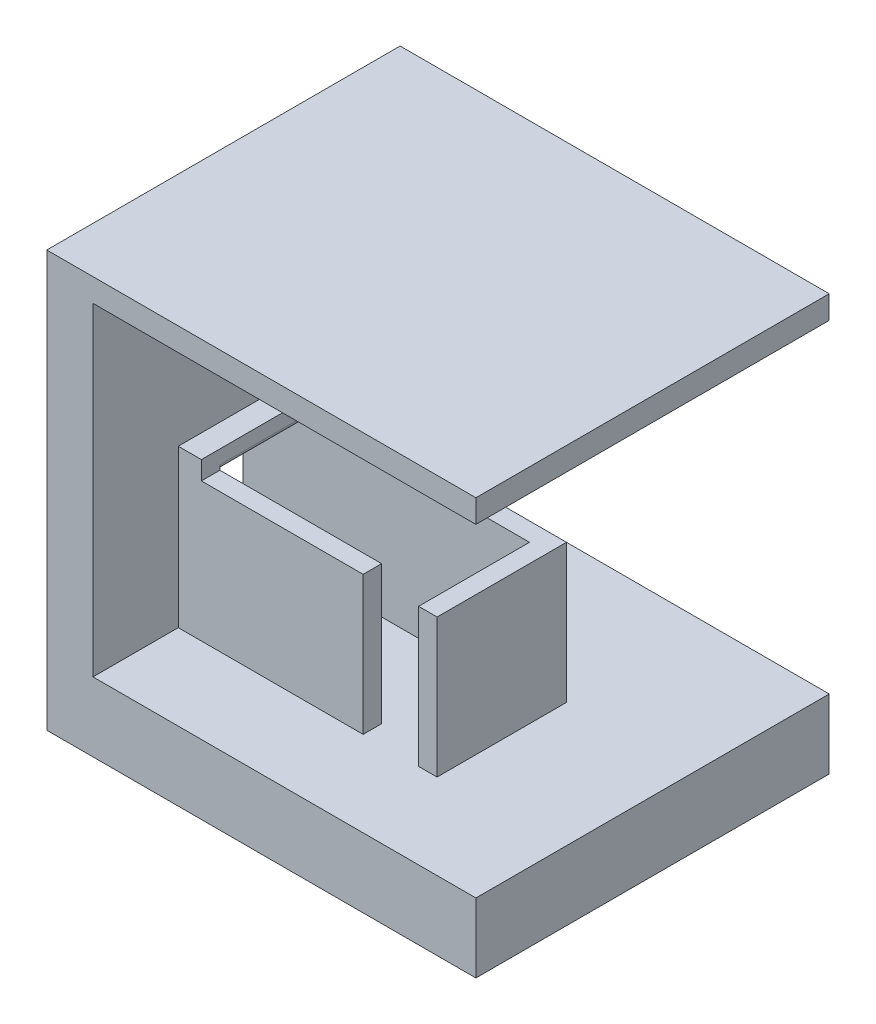
ISO-10303-21;
HEADER;
FILE_DESCRIPTION(('STEP AP214'),'2;1');
FILE_NAME('part.step','',(''),(''),'','','');
FILE_SCHEMA(('AUTOMOTIVE_DESIGN { 1 0 10303 214 1 1 1 1 }'));
ENDSEC;
DATA;
#1=APPLICATION_CONTEXT('core data for automotive mechanical design processes');
#2=APPLICATION_PROTOCOL_DEFINITION('international standard','automotive_design',2000,#1);
#3=PRODUCT_CONTEXT('',#1,'mechanical');
#4=PRODUCT('Part','Part','',(#3));
#5=PRODUCT_RELATED_PRODUCT_CATEGORY('part','',(#4));
#6=PRODUCT_DEFINITION_FORMATION('','',#4);
#7=PRODUCT_DEFINITION_CONTEXT('part definition',#1,'design');
#8=PRODUCT_DEFINITION('design','',#6,#7);
#9=PRODUCT_DEFINITION_SHAPE('','',#8);
#10=(LENGTH_UNIT() NAMED_UNIT(*) SI_UNIT(.MILLI.,.METRE.));
#11=(NAMED_UNIT(*) PLANE_ANGLE_UNIT() SI_UNIT($,.RADIAN.));
#12=(NAMED_UNIT(*) SI_UNIT($,.STERADIAN.) SOLID_ANGLE_UNIT());
#13=UNCERTAINTY_MEASURE_WITH_UNIT(LENGTH_MEASURE(1.E-05),#10,'distance_accuracy_value','');
#14=(GEOMETRIC_REPRESENTATION_CONTEXT(3) GLOBAL_UNCERTAINTY_ASSIGNED_CONTEXT((#13)) GLOBAL_UNIT_ASSIGNED_CONTEXT((#10,
#11,#12)) REPRESENTATION_CONTEXT('',''));
#15=CARTESIAN_POINT('',(0.,0.,0.));
#16=DIRECTION('',(0.,0.,1.));
#17=DIRECTION('',(1.,0.,0.));
#18=AXIS2_PLACEMENT_3D('',#15,#16,#17);
#19=CARTESIAN_POINT('',(-75.,20.,225.));
#20=DIRECTION('',(0.,-1.,0.));
#21=DIRECTION('',(0.,0.,-1.));
#22=AXIS2_PLACEMENT_3D('',#19,#20,#21);
#23=PLANE('',#22);
#24=DIRECTION('',(0.,0.,1.));
#25=VECTOR('',#24,1.);
#26=CARTESIAN_POINT('',(-28.5759394921588,20.,225.));
#27=LINE('',#26,#25);
#28=CARTESIAN_POINT('',(-28.5759394921588,20.,0.));
#29=VERTEX_POINT('',#28);
#30=CARTESIAN_POINT('',(-28.5759394921588,20.,38.2251271277598));
#31=VERTEX_POINT('',#30);
#32=EDGE_CURVE('E364',#29,#31,#27,.T.);
#33=ORIENTED_EDGE('',*,*,#32,.F.);
#34=DIRECTION('',(-1.,0.,0.));
#35=VECTOR('',#34,1.);
#36=CARTESIAN_POINT('',(-75.,20.,0.));
#37=LINE('',#36,#35);
#38=CARTESIAN_POINT('',(-75.,20.,0.));
#39=VERTEX_POINT('',#38);
#40=EDGE_CURVE('E493',#29,#39,#37,.T.);
#41=ORIENTED_EDGE('',*,*,#40,.T.);
#42=DIRECTION('',(0.,0.,-1.));
#43=VECTOR('',#42,1.);
#44=CARTESIAN_POINT('',(-75.,20.,225.));
#45=LINE('',#44,#43);
#46=CARTESIAN_POINT('',(-75.,20.,38.2251271277598));
#47=VERTEX_POINT('',#46);
#48=EDGE_CURVE('E502',#47,#39,#45,.T.);
#49=ORIENTED_EDGE('',*,*,#48,.F.);
#50=DIRECTION('',(-1.,0.,0.));
#51=VECTOR('',#50,1.);
#52=CARTESIAN_POINT('',(-75.,20.,38.2251271277598));
#53=LINE('',#52,#51);
#54=EDGE_CURVE('E705',#31,#47,#53,.T.);
#55=ORIENTED_EDGE('',*,*,#54,.F.);
#56=EDGE_LOOP('',(#33,#41,#49,#55));
#57=FACE_BOUND('',#56,.T.);
#58=ADVANCED_FACE('F173',(#57),#23,.F.);
#59=CARTESIAN_POINT('',(0.,0.,0.));
#60=DIRECTION('',(0.,0.,1.));
#61=DIRECTION('',(1.,0.,0.));
#62=AXIS2_PLACEMENT_3D('',#59,#60,#61);
#63=PLANE('',#62);
#64=DIRECTION('',(0.,1.,0.));
#65=VECTOR('',#64,1.);
#66=CARTESIAN_POINT('',(-28.5759394921588,-25.,0.));
#67=LINE('',#66,#65);
#68=CARTESIAN_POINT('',(-28.5759394921588,-25.,0.));
#69=VERTEX_POINT('',#68);
#70=CARTESIAN_POINT('',(-28.5759394921588,-17.5,0.));
#71=VERTEX_POINT('',#70);
#72=EDGE_CURVE('E331',#69,#71,#67,.T.);
#73=ORIENTED_EDGE('',*,*,#72,.F.);
#74=DIRECTION('',(1.,0.,0.));
#75=VECTOR('',#74,1.);
#76=CARTESIAN_POINT('',(-70.,-25.,0.));
#77=LINE('',#76,#75);
#78=CARTESIAN_POINT('',(-75.,-25.,0.));
#79=VERTEX_POINT('',#78);
#80=EDGE_CURVE('E345',#79,#69,#77,.T.);
#81=ORIENTED_EDGE('',*,*,#80,.F.);
#82=DIRECTION('',(0.,-1.,0.));
#83=VECTOR('',#82,1.);
#84=CARTESIAN_POINT('',(-75.,20.,0.));
#85=LINE('',#84,#83);
#86=EDGE_CURVE('E499',#39,#79,#85,.T.);
#87=ORIENTED_EDGE('',*,*,#86,.F.);
#88=ORIENTED_EDGE('',*,*,#40,.F.);
#89=CARTESIAN_POINT('',(-28.5759394921588,17.5,0.));
#90=VERTEX_POINT('',#89);
#91=EDGE_CURVE('E351',#90,#29,#67,.T.);
#92=ORIENTED_EDGE('',*,*,#91,.F.);
#93=DIRECTION('',(-1.,0.,0.));
#94=VECTOR('',#93,1.);
#95=CARTESIAN_POINT('',(-70.,17.5,0.));
#96=LINE('',#95,#94);
#97=CARTESIAN_POINT('',(-70.,17.5,0.));
#98=VERTEX_POINT('',#97);
#99=EDGE_CURVE('E483',#90,#98,#96,.T.);
#100=ORIENTED_EDGE('',*,*,#99,.T.);
#101=DIRECTION('',(0.,-1.,0.));
#102=VECTOR('',#101,1.);
#103=CARTESIAN_POINT('',(-70.,-17.5,0.));
#104=LINE('',#103,#102);
#105=CARTESIAN_POINT('',(-70.,-17.5,0.));
#106=VERTEX_POINT('',#105);
#107=EDGE_CURVE('E480',#98,#106,#104,.T.);
#108=ORIENTED_EDGE('',*,*,#107,.T.);
#109=DIRECTION('',(1.,0.,0.));
#110=VECTOR('',#109,1.);
#111=CARTESIAN_POINT('',(-70.,-17.5,0.));
#112=LINE('',#111,#110);
#113=EDGE_CURVE('E348',#106,#71,#112,.T.);
#114=ORIENTED_EDGE('',*,*,#113,.T.);
#115=EDGE_LOOP('',(#73,#81,#87,#88,#92,#100,#108,#114));
#116=FACE_BOUND('',#115,.T.);
#117=ADVANCED_FACE('F343',(#116),#63,.F.);
#118=CARTESIAN_POINT('',(-70.,-17.5,50.));
#119=DIRECTION('',(1.,0.,0.));
#120=DIRECTION('',(0.,1.,0.));
#121=AXIS2_PLACEMENT_3D('',#118,#119,#120);
#122=PLANE('',#121);
#123=DIRECTION('',(0.,0.,-1.));
#124=VECTOR('',#123,1.);
#125=CARTESIAN_POINT('',(-70.,-17.5,50.));
#126=LINE('',#125,#124);
#127=CARTESIAN_POINT('',(-70.,-17.5,15.));
#128=VERTEX_POINT('',#127);
#129=EDGE_CURVE('E494',#128,#106,#126,.T.);
#130=ORIENTED_EDGE('',*,*,#129,.T.);
#131=ORIENTED_EDGE('',*,*,#107,.F.);
#132=DIRECTION('',(0.,0.,-1.));
#133=VECTOR('',#132,1.);
#134=CARTESIAN_POINT('',(-70.,17.5,50.));
#135=LINE('',#134,#133);
#136=CARTESIAN_POINT('',(-70.,17.5,38.2251271277598));
#137=VERTEX_POINT('',#136);
#138=EDGE_CURVE('E489',#137,#98,#135,.T.);
#139=ORIENTED_EDGE('',*,*,#138,.F.);
#140=DIRECTION('',(0.,-1.,0.));
#141=VECTOR('',#140,1.);
#142=CARTESIAN_POINT('',(-70.,-17.5,38.2251271277598));
#143=LINE('',#142,#141);
#144=CARTESIAN_POINT('',(-70.,-17.5,38.2251271277598));
#145=VERTEX_POINT('',#144);
#146=EDGE_CURVE('E712',#137,#145,#143,.T.);
#147=ORIENTED_EDGE('',*,*,#146,.T.);
#148=CARTESIAN_POINT('',(-70.,-17.5,29.));
#149=VERTEX_POINT('',#148);
#150=EDGE_CURVE('E490',#145,#149,#126,.T.);
#151=ORIENTED_EDGE('',*,*,#150,.T.);
#152=DIRECTION('',(0.,-1.,0.));
#153=VECTOR('',#152,1.);
#154=CARTESIAN_POINT('',(-70.,-2.50000000000001,29.));
#155=LINE('',#154,#153);
#156=CARTESIAN_POINT('',(-70.,-0.500000000000007,29.));
#157=VERTEX_POINT('',#156);
#158=EDGE_CURVE('E413',#157,#149,#155,.T.);
#159=ORIENTED_EDGE('',*,*,#158,.F.);
#160=DIRECTION('',(0.,0.,1.));
#161=VECTOR('',#160,1.);
#162=CARTESIAN_POINT('',(-70.,-0.500000000000006,15.));
#163=LINE('',#162,#161);
#164=CARTESIAN_POINT('',(-70.,-0.500000000000007,15.));
#165=VERTEX_POINT('',#164);
#166=EDGE_CURVE('E357',#165,#157,#163,.T.);
#167=ORIENTED_EDGE('',*,*,#166,.F.);
#168=DIRECTION('',(0.,-1.,0.));
#169=VECTOR('',#168,1.);
#170=CARTESIAN_POINT('',(-70.,-2.50000000000001,15.));
#171=LINE('',#170,#169);
#172=EDGE_CURVE('E445',#165,#128,#171,.T.);
#173=ORIENTED_EDGE('',*,*,#172,.T.);
#174=EDGE_LOOP('',(#130,#131,#139,#147,#151,#159,#167,#173));
#175=FACE_BOUND('',#174,.T.);
#176=ADVANCED_FACE('F694',(#175),#122,.T.);
#177=CARTESIAN_POINT('',(-75.,20.,225.));
#178=DIRECTION('',(1.,0.,0.));
#179=DIRECTION('',(0.,0.,-1.));
#180=AXIS2_PLACEMENT_3D('',#177,#178,#179);
#181=PLANE('',#180);
#182=DIRECTION('',(0.,0.,1.));
#183=VECTOR('',#182,1.);
#184=CARTESIAN_POINT('',(-75.,-17.5,225.));
#185=LINE('',#184,#183);
#186=CARTESIAN_POINT('',(-75.,-17.5,17.));
#187=VERTEX_POINT('',#186);
#188=CARTESIAN_POINT('',(-75.,-17.5,27.));
#189=VERTEX_POINT('',#188);
#190=EDGE_CURVE('E518',#187,#189,#185,.T.);
#191=ORIENTED_EDGE('',*,*,#190,.F.);
#192=DIRECTION('',(0.,-1.,0.));
#193=VECTOR('',#192,1.);
#194=CARTESIAN_POINT('',(-75.,20.,17.));
#195=LINE('',#194,#193);
#196=CARTESIAN_POINT('',(-75.,-2.5,17.));
#197=VERTEX_POINT('',#196);
#198=EDGE_CURVE('E506',#197,#187,#195,.T.);
#199=ORIENTED_EDGE('',*,*,#198,.F.);
#200=DIRECTION('',(0.,0.,-1.));
#201=VECTOR('',#200,1.);
#202=CARTESIAN_POINT('',(-75.,-2.5,225.));
#203=LINE('',#202,#201);
#204=CARTESIAN_POINT('',(-75.,-2.5,27.));
#205=VERTEX_POINT('',#204);
#206=EDGE_CURVE('E510',#205,#197,#203,.T.);
#207=ORIENTED_EDGE('',*,*,#206,.F.);
#208=DIRECTION('',(0.,1.,0.));
#209=VECTOR('',#208,1.);
#210=CARTESIAN_POINT('',(-75.,20.,27.));
#211=LINE('',#210,#209);
#212=EDGE_CURVE('E514',#189,#205,#211,.T.);
#213=ORIENTED_EDGE('',*,*,#212,.F.);
#214=EDGE_LOOP('',(#191,#199,#207,#213));
#215=FACE_BOUND('',#214,.T.);
#216=ORIENTED_EDGE('',*,*,#86,.T.);
#217=DIRECTION('',(0.,0.,-1.));
#218=VECTOR('',#217,1.);
#219=CARTESIAN_POINT('',(-75.,-25.,82.));
#220=LINE('',#219,#218);
#221=CARTESIAN_POINT('',(-75.,-25.,38.2251271277598));
#222=VERTEX_POINT('',#221);
#223=EDGE_CURVE('E355',#222,#79,#220,.T.);
#224=ORIENTED_EDGE('',*,*,#223,.F.);
#225=DIRECTION('',(0.,1.,0.));
#226=VECTOR('',#225,1.);
#227=CARTESIAN_POINT('',(-75.,-25.,38.2251271277598));
#228=LINE('',#227,#226);
#229=EDGE_CURVE('E189',#222,#47,#228,.T.);
#230=ORIENTED_EDGE('',*,*,#229,.T.);
#231=ORIENTED_EDGE('',*,*,#48,.T.);
#232=EDGE_LOOP('',(#216,#224,#230,#231));
#233=FACE_BOUND('',#232,.T.);
#234=ADVANCED_FACE('F558',(#215,#233),#181,.F.);
#235=CARTESIAN_POINT('',(-70.,-17.5,50.));
#236=DIRECTION('',(0.,1.,0.));
#237=DIRECTION('',(0.,0.,1.));
#238=AXIS2_PLACEMENT_3D('',#235,#236,#237);
#239=PLANE('',#238);
#240=DIRECTION('',(1.,0.,0.));
#241=VECTOR('',#240,1.);
#242=CARTESIAN_POINT('',(-70.,-17.5,38.2251271277598));
#243=LINE('',#242,#241);
#244=CARTESIAN_POINT('',(-28.5759394921588,-17.5,38.2251271277598));
#245=VERTEX_POINT('',#244);
#246=EDGE_CURVE('E698',#145,#245,#243,.T.);
#247=ORIENTED_EDGE('',*,*,#246,.T.);
#248=DIRECTION('',(0.,0.,-1.));
#249=VECTOR('',#248,1.);
#250=CARTESIAN_POINT('',(-28.5759394921588,-17.5,50.));
#251=LINE('',#250,#249);
#252=EDGE_CURVE('E696',#245,#71,#251,.T.);
#253=ORIENTED_EDGE('',*,*,#252,.T.);
#254=ORIENTED_EDGE('',*,*,#113,.F.);
#255=ORIENTED_EDGE('',*,*,#129,.F.);
#256=DIRECTION('',(1.,0.,0.));
#257=VECTOR('',#256,1.);
#258=CARTESIAN_POINT('',(-70.,-17.5,15.));
#259=LINE('',#258,#257);
#260=CARTESIAN_POINT('',(-42.,-17.5,15.));
#261=VERTEX_POINT('',#260);
#262=EDGE_CURVE('E458',#128,#261,#259,.T.);
#263=ORIENTED_EDGE('',*,*,#262,.T.);
#264=DIRECTION('',(0.,0.,1.));
#265=VECTOR('',#264,1.);
#266=CARTESIAN_POINT('',(-42.,-17.5,175.));
#267=LINE('',#266,#265);
#268=CARTESIAN_POINT('',(-42.,-17.5,29.));
#269=VERTEX_POINT('',#268);
#270=EDGE_CURVE('E455',#261,#269,#267,.T.);
#271=ORIENTED_EDGE('',*,*,#270,.T.);
#272=DIRECTION('',(-1.,0.,0.));
#273=VECTOR('',#272,1.);
#274=CARTESIAN_POINT('',(-70.,-17.5,29.));
#275=LINE('',#274,#273);
#276=CARTESIAN_POINT('',(-44.,-17.5,29.));
#277=VERTEX_POINT('',#276);
#278=EDGE_CURVE('E452',#269,#277,#275,.T.);
#279=ORIENTED_EDGE('',*,*,#278,.T.);
#280=DIRECTION('',(0.,0.,-1.));
#281=VECTOR('',#280,1.);
#282=CARTESIAN_POINT('',(-44.,-17.5,175.));
#283=LINE('',#282,#281);
#284=CARTESIAN_POINT('',(-44.,-17.5,17.));
#285=VERTEX_POINT('',#284);
#286=EDGE_CURVE('E449',#277,#285,#283,.T.);
#287=ORIENTED_EDGE('',*,*,#286,.T.);
#288=DIRECTION('',(1.,0.,0.));
#289=VECTOR('',#288,1.);
#290=CARTESIAN_POINT('',(-70.,-17.5,17.));
#291=LINE('',#290,#289);
#292=EDGE_CURVE('E417',#187,#285,#291,.T.);
#293=ORIENTED_EDGE('',*,*,#292,.F.);
#294=ORIENTED_EDGE('',*,*,#190,.T.);
#295=DIRECTION('',(1.,0.,0.));
#296=VECTOR('',#295,1.);
#297=CARTESIAN_POINT('',(-70.,-17.5,27.));
#298=LINE('',#297,#296);
#299=CARTESIAN_POINT('',(-50.,-17.5,27.));
#300=VERTEX_POINT('',#299);
#301=EDGE_CURVE('E389',#189,#300,#298,.T.);
#302=ORIENTED_EDGE('',*,*,#301,.T.);
#303=DIRECTION('',(0.,0.,1.));
#304=VECTOR('',#303,1.);
#305=CARTESIAN_POINT('',(-50.,-17.5,175.));
#306=LINE('',#305,#304);
#307=CARTESIAN_POINT('',(-50.,-17.5,29.));
#308=VERTEX_POINT('',#307);
#309=EDGE_CURVE('E406',#300,#308,#306,.T.);
#310=ORIENTED_EDGE('',*,*,#309,.T.);
#311=DIRECTION('',(-1.,0.,0.));
#312=VECTOR('',#311,1.);
#313=CARTESIAN_POINT('',(-70.,-17.5,29.));
#314=LINE('',#313,#312);
#315=EDGE_CURVE('E409',#308,#149,#314,.T.);
#316=ORIENTED_EDGE('',*,*,#315,.T.);
#317=ORIENTED_EDGE('',*,*,#150,.F.);
#318=EDGE_LOOP('',(#247,#253,#254,#255,#263,#271,#279,#287,#293,#294,#302,#310,#316,#317));
#319=FACE_BOUND('',#318,.T.);
#320=ADVANCED_FACE('F563',(#319),#239,.T.);
#321=CARTESIAN_POINT('',(-70.,17.5,50.));
#322=DIRECTION('',(0.,-1.,0.));
#323=DIRECTION('',(0.,0.,-1.));
#324=AXIS2_PLACEMENT_3D('',#321,#322,#323);
#325=PLANE('',#324);
#326=ORIENTED_EDGE('',*,*,#99,.F.);
#327=DIRECTION('',(0.,0.,1.));
#328=VECTOR('',#327,1.);
#329=CARTESIAN_POINT('',(-28.5759394921588,17.5,50.));
#330=LINE('',#329,#328);
#331=CARTESIAN_POINT('',(-28.5759394921588,17.5,38.2251271277598));
#332=VERTEX_POINT('',#331);
#333=EDGE_CURVE('E700',#90,#332,#330,.T.);
#334=ORIENTED_EDGE('',*,*,#333,.T.);
#335=DIRECTION('',(-1.,0.,0.));
#336=VECTOR('',#335,1.);
#337=CARTESIAN_POINT('',(-70.,17.5,38.2251271277598));
#338=LINE('',#337,#336);
#339=EDGE_CURVE('E350',#332,#137,#338,.T.);
#340=ORIENTED_EDGE('',*,*,#339,.T.);
#341=ORIENTED_EDGE('',*,*,#138,.T.);
#342=EDGE_LOOP('',(#326,#334,#340,#341));
#343=FACE_BOUND('',#342,.T.);
#344=ADVANCED_FACE('F740',(#343),#325,.T.);
#345=CARTESIAN_POINT('',(0.,-25.,0.));
#346=DIRECTION('',(0.,-1.,0.));
#347=DIRECTION('',(0.,0.,-1.));
#348=AXIS2_PLACEMENT_3D('',#345,#346,#347);
#349=PLANE('',#348);
#350=ORIENTED_EDGE('',*,*,#223,.T.);
#351=ORIENTED_EDGE('',*,*,#80,.T.);
#352=DIRECTION('',(0.,0.,-1.));
#353=VECTOR('',#352,1.);
#354=CARTESIAN_POINT('',(-28.5759394921588,-25.,0.));
#355=LINE('',#354,#353);
#356=CARTESIAN_POINT('',(-28.5759394921588,-25.,38.2251271277598));
#357=VERTEX_POINT('',#356);
#358=EDGE_CURVE('E328',#357,#69,#355,.T.);
#359=ORIENTED_EDGE('',*,*,#358,.F.);
#360=DIRECTION('',(1.,0.,0.));
#361=VECTOR('',#360,1.);
#362=CARTESIAN_POINT('',(-75.,-25.,38.2251271277598));
#363=LINE('',#362,#361);
#364=EDGE_CURVE('E338',#222,#357,#363,.T.);
#365=ORIENTED_EDGE('',*,*,#364,.F.);
#366=EDGE_LOOP('',(#350,#351,#359,#365));
#367=FACE_BOUND('',#366,.T.);
#368=ADVANCED_FACE('F353',(#367),#349,.T.);
#369=CARTESIAN_POINT('',(-70.,-2.50000000000001,17.));
#370=DIRECTION('',(0.,0.,-1.));
#371=DIRECTION('',(-1.,0.,0.));
#372=AXIS2_PLACEMENT_3D('',#369,#370,#371);
#373=PLANE('',#372);
#374=ORIENTED_EDGE('',*,*,#292,.T.);
#375=DIRECTION('',(0.,-1.,0.));
#376=VECTOR('',#375,1.);
#377=CARTESIAN_POINT('',(-44.,-2.50000000000001,17.));
#378=LINE('',#377,#376);
#379=CARTESIAN_POINT('',(-44.,-2.50000000000001,17.));
#380=VERTEX_POINT('',#379);
#381=EDGE_CURVE('E476',#380,#285,#378,.T.);
#382=ORIENTED_EDGE('',*,*,#381,.F.);
#383=DIRECTION('',(1.,0.,0.));
#384=VECTOR('',#383,1.);
#385=CARTESIAN_POINT('',(-70.,-2.50000000000001,17.));
#386=LINE('',#385,#384);
#387=CARTESIAN_POINT('',(-67.5,-2.50000000000001,17.));
#388=VERTEX_POINT('',#387);
#389=EDGE_CURVE('E430',#388,#380,#386,.T.);
#390=ORIENTED_EDGE('',*,*,#389,.F.);
#391=DIRECTION('',(0.,-1.,0.));
#392=VECTOR('',#391,1.);
#393=CARTESIAN_POINT('',(-67.5,-2.50000000000001,17.));
#394=LINE('',#393,#392);
#395=CARTESIAN_POINT('',(-67.5,-2.00000000000001,17.));
#396=VERTEX_POINT('',#395);
#397=EDGE_CURVE('E529',#396,#388,#394,.T.);
#398=ORIENTED_EDGE('',*,*,#397,.F.);
#399=CARTESIAN_POINT('',(-68.,-2.00000000000001,17.));
#400=DIRECTION('',(0.,0.,-1.));
#401=DIRECTION('',(-1.,0.,0.));
#402=AXIS2_PLACEMENT_3D('',#399,#400,#401);
#403=CIRCLE('',#402,0.5);
#404=CARTESIAN_POINT('',(-68.,-2.50000000000001,17.));
#405=VERTEX_POINT('',#404);
#406=EDGE_CURVE('E12',#396,#405,#403,.T.);
#407=ORIENTED_EDGE('',*,*,#406,.T.);
#408=EDGE_CURVE('E425',#197,#405,#386,.T.);
#409=ORIENTED_EDGE('',*,*,#408,.F.);
#410=ORIENTED_EDGE('',*,*,#198,.T.);
#411=EDGE_LOOP('',(#374,#382,#390,#398,#407,#409,#410));
#412=FACE_BOUND('',#411,.T.);
#413=ADVANCED_FACE('F549',(#412),#373,.F.);
#414=CARTESIAN_POINT('',(-44.,-2.50000000000001,175.));
#415=DIRECTION('',(-1.,0.,0.));
#416=DIRECTION('',(0.,0.,1.));
#417=AXIS2_PLACEMENT_3D('',#414,#415,#416);
#418=PLANE('',#417);
#419=ORIENTED_EDGE('',*,*,#286,.F.);
#420=DIRECTION('',(0.,-1.,0.));
#421=VECTOR('',#420,1.);
#422=CARTESIAN_POINT('',(-44.,-2.50000000000001,29.));
#423=LINE('',#422,#421);
#424=CARTESIAN_POINT('',(-44.,-2.50000000000001,29.));
#425=VERTEX_POINT('',#424);
#426=EDGE_CURVE('E472',#425,#277,#423,.T.);
#427=ORIENTED_EDGE('',*,*,#426,.F.);
#428=DIRECTION('',(0.,0.,-1.));
#429=VECTOR('',#428,1.);
#430=CARTESIAN_POINT('',(-44.,-2.50000000000001,175.));
#431=LINE('',#430,#429);
#432=EDGE_CURVE('E429',#425,#380,#431,.T.);
#433=ORIENTED_EDGE('',*,*,#432,.T.);
#434=ORIENTED_EDGE('',*,*,#381,.T.);
#435=EDGE_LOOP('',(#419,#427,#433,#434));
#436=FACE_BOUND('',#435,.T.);
#437=ADVANCED_FACE('F567',(#436),#418,.T.);
#438=CARTESIAN_POINT('',(-70.,-2.50000000000001,29.));
#439=DIRECTION('',(0.,0.,1.));
#440=DIRECTION('',(1.,0.,0.));
#441=AXIS2_PLACEMENT_3D('',#438,#439,#440);
#442=PLANE('',#441);
#443=ORIENTED_EDGE('',*,*,#278,.F.);
#444=DIRECTION('',(0.,-1.,0.));
#445=VECTOR('',#444,1.);
#446=CARTESIAN_POINT('',(-42.,-2.50000000000001,29.));
#447=LINE('',#446,#445);
#448=CARTESIAN_POINT('',(-42.,-2.50000000000001,29.));
#449=VERTEX_POINT('',#448);
#450=EDGE_CURVE('E468',#449,#269,#447,.T.);
#451=ORIENTED_EDGE('',*,*,#450,.F.);
#452=DIRECTION('',(-1.,0.,0.));
#453=VECTOR('',#452,1.);
#454=CARTESIAN_POINT('',(-70.,-2.50000000000001,29.));
#455=LINE('',#454,#453);
#456=EDGE_CURVE('E434',#449,#425,#455,.T.);
#457=ORIENTED_EDGE('',*,*,#456,.T.);
#458=ORIENTED_EDGE('',*,*,#426,.T.);
#459=EDGE_LOOP('',(#443,#451,#457,#458));
#460=FACE_BOUND('',#459,.T.);
#461=ADVANCED_FACE('F574',(#460),#442,.T.);
#462=CARTESIAN_POINT('',(-42.,-2.50000000000001,175.));
#463=DIRECTION('',(1.,0.,0.));
#464=DIRECTION('',(0.,0.,-1.));
#465=AXIS2_PLACEMENT_3D('',#462,#463,#464);
#466=PLANE('',#465);
#467=ORIENTED_EDGE('',*,*,#270,.F.);
#468=DIRECTION('',(0.,-1.,0.));
#469=VECTOR('',#468,1.);
#470=CARTESIAN_POINT('',(-42.,-2.50000000000001,15.));
#471=LINE('',#470,#469);
#472=CARTESIAN_POINT('',(-42.,-2.50000000000001,15.));
#473=VERTEX_POINT('',#472);
#474=EDGE_CURVE('E464',#473,#261,#471,.T.);
#475=ORIENTED_EDGE('',*,*,#474,.F.);
#476=DIRECTION('',(0.,0.,1.));
#477=VECTOR('',#476,1.);
#478=CARTESIAN_POINT('',(-42.,-2.50000000000001,175.));
#479=LINE('',#478,#477);
#480=EDGE_CURVE('E438',#473,#449,#479,.T.);
#481=ORIENTED_EDGE('',*,*,#480,.T.);
#482=ORIENTED_EDGE('',*,*,#450,.T.);
#483=EDGE_LOOP('',(#467,#475,#481,#482));
#484=FACE_BOUND('',#483,.T.);
#485=ADVANCED_FACE('F577',(#484),#466,.T.);
#486=CARTESIAN_POINT('',(-70.,-2.50000000000001,15.));
#487=DIRECTION('',(0.,0.,-1.));
#488=DIRECTION('',(-1.,0.,0.));
#489=AXIS2_PLACEMENT_3D('',#486,#487,#488);
#490=PLANE('',#489);
#491=ORIENTED_EDGE('',*,*,#262,.F.);
#492=ORIENTED_EDGE('',*,*,#172,.F.);
#493=DIRECTION('',(-1.,0.,0.));
#494=VECTOR('',#493,1.);
#495=CARTESIAN_POINT('',(-67.5,-0.500000000000007,15.));
#496=LINE('',#495,#494);
#497=CARTESIAN_POINT('',(-67.5,-0.500000000000007,15.));
#498=VERTEX_POINT('',#497);
#499=EDGE_CURVE('E385',#498,#165,#496,.T.);
#500=ORIENTED_EDGE('',*,*,#499,.F.);
#501=DIRECTION('',(0.,1.,0.));
#502=VECTOR('',#501,1.);
#503=CARTESIAN_POINT('',(-67.5,-2.50000000000001,15.));
#504=LINE('',#503,#502);
#505=CARTESIAN_POINT('',(-67.5,-2.50000000000001,15.));
#506=VERTEX_POINT('',#505);
#507=EDGE_CURVE('E371',#506,#498,#504,.T.);
#508=ORIENTED_EDGE('',*,*,#507,.F.);
#509=DIRECTION('',(1.,0.,0.));
#510=VECTOR('',#509,1.);
#511=CARTESIAN_POINT('',(-70.,-2.50000000000001,15.));
#512=LINE('',#511,#510);
#513=EDGE_CURVE('E442',#506,#473,#512,.T.);
#514=ORIENTED_EDGE('',*,*,#513,.T.);
#515=ORIENTED_EDGE('',*,*,#474,.T.);
#516=EDGE_LOOP('',(#491,#492,#500,#508,#514,#515));
#517=FACE_BOUND('',#516,.T.);
#518=ADVANCED_FACE('F584',(#517),#490,.T.);
#519=CARTESIAN_POINT('',(0.,-2.50000000000001,0.));
#520=DIRECTION('',(0.,1.,0.));
#521=DIRECTION('',(0.,0.,1.));
#522=AXIS2_PLACEMENT_3D('',#519,#520,#521);
#523=PLANE('',#522);
#524=DIRECTION('',(0.,0.,1.));
#525=VECTOR('',#524,1.);
#526=CARTESIAN_POINT('',(-67.5,-2.50000000000001,15.));
#527=LINE('',#526,#525);
#528=EDGE_CURVE('E362',#506,#388,#527,.T.);
#529=ORIENTED_EDGE('',*,*,#528,.T.);
#530=ORIENTED_EDGE('',*,*,#389,.T.);
#531=ORIENTED_EDGE('',*,*,#432,.F.);
#532=ORIENTED_EDGE('',*,*,#456,.F.);
#533=ORIENTED_EDGE('',*,*,#480,.F.);
#534=ORIENTED_EDGE('',*,*,#513,.F.);
#535=EDGE_LOOP('',(#529,#530,#531,#532,#533,#534));
#536=FACE_BOUND('',#535,.T.);
#537=ADVANCED_FACE('F571',(#536),#523,.T.);
#538=CARTESIAN_POINT('',(-70.,-2.50000000000001,27.));
#539=DIRECTION('',(0.,0.,-1.));
#540=DIRECTION('',(-1.,0.,0.));
#541=AXIS2_PLACEMENT_3D('',#538,#539,#540);
#542=PLANE('',#541);
#543=ORIENTED_EDGE('',*,*,#301,.F.);
#544=ORIENTED_EDGE('',*,*,#212,.T.);
#545=DIRECTION('',(1.,0.,0.));
#546=VECTOR('',#545,1.);
#547=CARTESIAN_POINT('',(-70.,-2.50000000000001,27.));
#548=LINE('',#547,#546);
#549=CARTESIAN_POINT('',(-68.,-2.50000000000001,27.));
#550=VERTEX_POINT('',#549);
#551=EDGE_CURVE('E390',#205,#550,#548,.T.);
#552=ORIENTED_EDGE('',*,*,#551,.T.);
#553=CARTESIAN_POINT('',(-68.,-2.00000000000001,27.));
#554=DIRECTION('',(0.,0.,-1.));
#555=DIRECTION('',(-1.,0.,0.));
#556=AXIS2_PLACEMENT_3D('',#553,#554,#555);
#557=CIRCLE('',#556,0.5);
#558=CARTESIAN_POINT('',(-67.5,-2.00000000000001,27.));
#559=VERTEX_POINT('',#558);
#560=EDGE_CURVE('E182',#550,#559,#557,.F.);
#561=ORIENTED_EDGE('',*,*,#560,.T.);
#562=DIRECTION('',(0.,1.,0.));
#563=VECTOR('',#562,1.);
#564=CARTESIAN_POINT('',(-67.5,0.,27.));
#565=LINE('',#564,#563);
#566=CARTESIAN_POINT('',(-67.5,-2.50000000000001,27.));
#567=VERTEX_POINT('',#566);
#568=EDGE_CURVE('E197',#567,#559,#565,.T.);
#569=ORIENTED_EDGE('',*,*,#568,.F.);
#570=CARTESIAN_POINT('',(-50.,-2.50000000000001,27.));
#571=VERTEX_POINT('',#570);
#572=EDGE_CURVE('E395',#567,#571,#548,.T.);
#573=ORIENTED_EDGE('',*,*,#572,.T.);
#574=DIRECTION('',(0.,-1.,0.));
#575=VECTOR('',#574,1.);
#576=CARTESIAN_POINT('',(-50.,-2.50000000000001,27.));
#577=LINE('',#576,#575);
#578=EDGE_CURVE('E403',#571,#300,#577,.T.);
#579=ORIENTED_EDGE('',*,*,#578,.T.);
#580=EDGE_LOOP('',(#543,#544,#552,#561,#569,#573,#579));
#581=FACE_BOUND('',#580,.T.);
#582=ADVANCED_FACE('F539',(#581),#542,.T.);
#583=CARTESIAN_POINT('',(-70.,-2.50000000000001,29.));
#584=DIRECTION('',(0.,0.,1.));
#585=DIRECTION('',(1.,0.,0.));
#586=AXIS2_PLACEMENT_3D('',#583,#584,#585);
#587=PLANE('',#586);
#588=ORIENTED_EDGE('',*,*,#315,.F.);
#589=DIRECTION('',(0.,-1.,0.));
#590=VECTOR('',#589,1.);
#591=CARTESIAN_POINT('',(-50.,-2.50000000000001,29.));
#592=LINE('',#591,#590);
#593=CARTESIAN_POINT('',(-50.,-2.50000000000001,29.));
#594=VERTEX_POINT('',#593);
#595=EDGE_CURVE('E418',#594,#308,#592,.T.);
#596=ORIENTED_EDGE('',*,*,#595,.F.);
#597=DIRECTION('',(-1.,0.,0.));
#598=VECTOR('',#597,1.);
#599=CARTESIAN_POINT('',(-70.,-2.50000000000001,29.));
#600=LINE('',#599,#598);
#601=CARTESIAN_POINT('',(-67.5,-2.50000000000001,29.));
#602=VERTEX_POINT('',#601);
#603=EDGE_CURVE('E399',#594,#602,#600,.T.);
#604=ORIENTED_EDGE('',*,*,#603,.T.);
#605=DIRECTION('',(0.,1.,0.));
#606=VECTOR('',#605,1.);
#607=CARTESIAN_POINT('',(-67.5,-2.50000000000001,29.));
#608=LINE('',#607,#606);
#609=CARTESIAN_POINT('',(-67.5,-0.500000000000007,29.));
#610=VERTEX_POINT('',#609);
#611=EDGE_CURVE('E377',#602,#610,#608,.T.);
#612=ORIENTED_EDGE('',*,*,#611,.T.);
#613=DIRECTION('',(-1.,0.,0.));
#614=VECTOR('',#613,1.);
#615=CARTESIAN_POINT('',(-67.5,-0.500000000000007,29.));
#616=LINE('',#615,#614);
#617=EDGE_CURVE('E380',#610,#157,#616,.T.);
#618=ORIENTED_EDGE('',*,*,#617,.T.);
#619=ORIENTED_EDGE('',*,*,#158,.T.);
#620=EDGE_LOOP('',(#588,#596,#604,#612,#618,#619));
#621=FACE_BOUND('',#620,.T.);
#622=ADVANCED_FACE('F592',(#621),#587,.T.);
#623=CARTESIAN_POINT('',(-50.,-2.50000000000001,175.));
#624=DIRECTION('',(1.,0.,0.));
#625=DIRECTION('',(0.,0.,-1.));
#626=AXIS2_PLACEMENT_3D('',#623,#624,#625);
#627=PLANE('',#626);
#628=ORIENTED_EDGE('',*,*,#309,.F.);
#629=ORIENTED_EDGE('',*,*,#578,.F.);
#630=DIRECTION('',(0.,0.,1.));
#631=VECTOR('',#630,1.);
#632=CARTESIAN_POINT('',(-50.,-2.50000000000001,175.));
#633=LINE('',#632,#631);
#634=EDGE_CURVE('E394',#571,#594,#633,.T.);
#635=ORIENTED_EDGE('',*,*,#634,.T.);
#636=ORIENTED_EDGE('',*,*,#595,.T.);
#637=EDGE_LOOP('',(#628,#629,#635,#636));
#638=FACE_BOUND('',#637,.T.);
#639=ADVANCED_FACE('F600',(#638),#627,.T.);
#640=CARTESIAN_POINT('',(0.,-2.50000000000001,0.));
#641=DIRECTION('',(0.,-1.,0.));
#642=DIRECTION('',(0.,0.,-1.));
#643=AXIS2_PLACEMENT_3D('',#640,#641,#642);
#644=PLANE('',#643);
#645=ORIENTED_EDGE('',*,*,#572,.F.);
#646=DIRECTION('',(0.,0.,1.));
#647=VECTOR('',#646,1.);
#648=CARTESIAN_POINT('',(-67.5,-2.50000000000001,0.));
#649=LINE('',#648,#647);
#650=EDGE_CURVE('E522',#567,#602,#649,.T.);
#651=ORIENTED_EDGE('',*,*,#650,.T.);
#652=ORIENTED_EDGE('',*,*,#603,.F.);
#653=ORIENTED_EDGE('',*,*,#634,.F.);
#654=EDGE_LOOP('',(#645,#651,#652,#653));
#655=FACE_BOUND('',#654,.T.);
#656=ADVANCED_FACE('F596',(#655),#644,.F.);
#657=CARTESIAN_POINT('',(-85.,-2.5,17.));
#658=DIRECTION('',(0.,-1.,0.));
#659=DIRECTION('',(1.,0.,0.));
#660=AXIS2_PLACEMENT_3D('',#657,#658,#659);
#661=PLANE('',#660);
#662=ORIENTED_EDGE('',*,*,#408,.T.);
#663=DIRECTION('',(0.,0.,1.));
#664=VECTOR('',#663,1.);
#665=CARTESIAN_POINT('',(-68.,-2.50000000000001,17.));
#666=LINE('',#665,#664);
#667=EDGE_CURVE('E525',#405,#550,#666,.T.);
#668=ORIENTED_EDGE('',*,*,#667,.T.);
#669=ORIENTED_EDGE('',*,*,#551,.F.);
#670=ORIENTED_EDGE('',*,*,#206,.T.);
#671=EDGE_LOOP('',(#662,#668,#669,#670));
#672=FACE_BOUND('',#671,.T.);
#673=ADVANCED_FACE('F552',(#672),#661,.T.);
#674=CARTESIAN_POINT('',(-67.5,-0.500000000000007,15.));
#675=DIRECTION('',(0.,-1.,0.));
#676=DIRECTION('',(1.,0.,0.));
#677=AXIS2_PLACEMENT_3D('',#674,#675,#676);
#678=PLANE('',#677);
#679=ORIENTED_EDGE('',*,*,#166,.T.);
#680=ORIENTED_EDGE('',*,*,#617,.F.);
#681=DIRECTION('',(0.,0.,1.));
#682=VECTOR('',#681,1.);
#683=CARTESIAN_POINT('',(-67.5,-0.500000000000007,15.));
#684=LINE('',#683,#682);
#685=EDGE_CURVE('E374',#498,#610,#684,.T.);
#686=ORIENTED_EDGE('',*,*,#685,.F.);
#687=ORIENTED_EDGE('',*,*,#499,.T.);
#688=EDGE_LOOP('',(#679,#680,#686,#687));
#689=FACE_BOUND('',#688,.T.);
#690=ADVANCED_FACE('F588',(#689),#678,.F.);
#691=CARTESIAN_POINT('',(-67.5,0.,0.));
#692=DIRECTION('',(1.,0.,0.));
#693=DIRECTION('',(0.,0.,1.));
#694=AXIS2_PLACEMENT_3D('',#691,#692,#693);
#695=PLANE('',#694);
#696=ORIENTED_EDGE('',*,*,#650,.F.);
#697=ORIENTED_EDGE('',*,*,#568,.T.);
#698=DIRECTION('',(0.,0.,1.));
#699=VECTOR('',#698,1.);
#700=CARTESIAN_POINT('',(-67.5,-2.00000000000001,0.));
#701=LINE('',#700,#699);
#702=EDGE_CURVE('E532',#559,#396,#701,.F.);
#703=ORIENTED_EDGE('',*,*,#702,.T.);
#704=ORIENTED_EDGE('',*,*,#397,.T.);
#705=ORIENTED_EDGE('',*,*,#528,.F.);
#706=ORIENTED_EDGE('',*,*,#507,.T.);
#707=ORIENTED_EDGE('',*,*,#685,.T.);
#708=ORIENTED_EDGE('',*,*,#611,.F.);
#709=EDGE_LOOP('',(#696,#697,#703,#704,#705,#706,#707,#708));
#710=FACE_BOUND('',#709,.T.);
#711=ADVANCED_FACE('F544',(#710),#695,.T.);
#712=CARTESIAN_POINT('',(-68.,-2.00000000000001,17.));
#713=DIRECTION('',(0.,0.,1.));
#714=DIRECTION('',(1.,0.,0.));
#715=AXIS2_PLACEMENT_3D('',#712,#713,#714);
#716=CYLINDRICAL_SURFACE('',#715,0.5);
#717=ORIENTED_EDGE('',*,*,#406,.F.);
#718=ORIENTED_EDGE('',*,*,#702,.F.);
#719=ORIENTED_EDGE('',*,*,#560,.F.);
#720=ORIENTED_EDGE('',*,*,#667,.F.);
#721=EDGE_LOOP('',(#717,#718,#719,#720));
#722=FACE_BOUND('',#721,.T.);
#723=ADVANCED_FACE('F175',(#722),#716,.T.);
#724=CARTESIAN_POINT('',(-75.,-25.,38.2251271277598));
#725=DIRECTION('',(0.,0.,1.));
#726=DIRECTION('',(1.,0.,0.));
#727=AXIS2_PLACEMENT_3D('',#724,#725,#726);
#728=PLANE('',#727);
#729=ORIENTED_EDGE('',*,*,#54,.T.);
#730=ORIENTED_EDGE('',*,*,#229,.F.);
#731=ORIENTED_EDGE('',*,*,#364,.T.);
#732=DIRECTION('',(0.,1.,0.));
#733=VECTOR('',#732,1.);
#734=CARTESIAN_POINT('',(-28.5759394921588,-25.,38.2251271277598));
#735=LINE('',#734,#733);
#736=EDGE_CURVE('E334',#357,#245,#735,.T.);
#737=ORIENTED_EDGE('',*,*,#736,.T.);
#738=ORIENTED_EDGE('',*,*,#246,.F.);
#739=ORIENTED_EDGE('',*,*,#146,.F.);
#740=ORIENTED_EDGE('',*,*,#339,.F.);
#741=EDGE_CURVE('E721',#332,#31,#735,.T.);
#742=ORIENTED_EDGE('',*,*,#741,.T.);
#743=EDGE_LOOP('',(#729,#730,#731,#737,#738,#739,#740,#742));
#744=FACE_BOUND('',#743,.T.);
#745=ADVANCED_FACE('F725',(#744),#728,.T.);
#746=CARTESIAN_POINT('',(-28.5759394921588,-25.,0.));
#747=DIRECTION('',(1.,0.,0.));
#748=DIRECTION('',(0.,0.,-1.));
#749=AXIS2_PLACEMENT_3D('',#746,#747,#748);
#750=PLANE('',#749);
#751=ORIENTED_EDGE('',*,*,#736,.F.);
#752=ORIENTED_EDGE('',*,*,#358,.T.);
#753=ORIENTED_EDGE('',*,*,#72,.T.);
#754=ORIENTED_EDGE('',*,*,#252,.F.);
#755=EDGE_LOOP('',(#751,#752,#753,#754));
#756=FACE_BOUND('',#755,.T.);
#757=ADVANCED_FACE('F330',(#756),#750,.T.);
#758=ORIENTED_EDGE('',*,*,#32,.T.);
#759=ORIENTED_EDGE('',*,*,#741,.F.);
#760=ORIENTED_EDGE('',*,*,#333,.F.);
#761=ORIENTED_EDGE('',*,*,#91,.T.);
#762=EDGE_LOOP('',(#758,#759,#760,#761));
#763=FACE_BOUND('',#762,.T.);
#764=ADVANCED_FACE('F736',(#763),#750,.T.);
#765=CLOSED_SHELL('',(#58,#117,#176,#234,#320,#344,#368,#413,#437,#461,#485,#518,#537,#582,#622,
#639,#656,#673,#690,#711,#723,#745,#757,#764));
#766=MANIFOLD_SOLID_BREP('B2',#765);
#767=ADVANCED_BREP_SHAPE_REPRESENTATION('',(#18,#766),#14);
#768=SHAPE_DEFINITION_REPRESENTATION(#9,#767);
ENDSEC;
END-ISO-10303-21;
